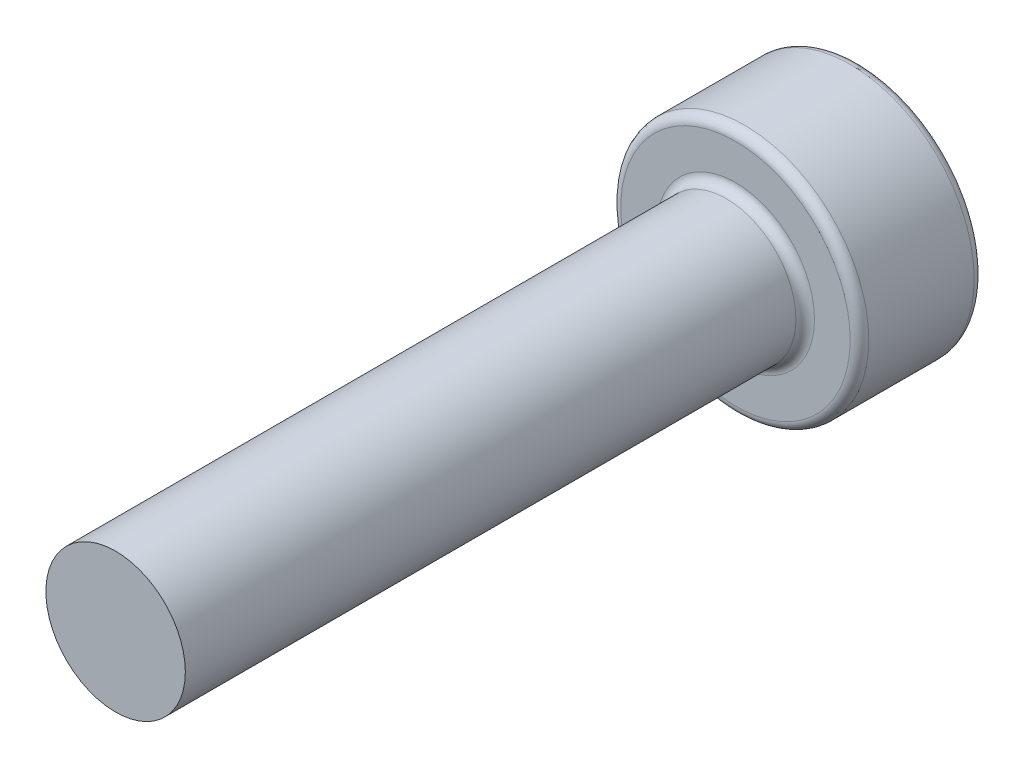
ISO-10303-21;
HEADER;
FILE_DESCRIPTION(('STEP AP214'),'2;1');
FILE_NAME('part.step','',(''),(''),'','','');
FILE_SCHEMA(('AUTOMOTIVE_DESIGN { 1 0 10303 214 1 1 1 1 }'));
ENDSEC;
DATA;
#1=APPLICATION_CONTEXT('core data for automotive mechanical design processes');
#2=APPLICATION_PROTOCOL_DEFINITION('international standard','automotive_design',2000,#1);
#3=PRODUCT_CONTEXT('',#1,'mechanical');
#4=PRODUCT('Part','Part','',(#3));
#5=PRODUCT_RELATED_PRODUCT_CATEGORY('part','',(#4));
#6=PRODUCT_DEFINITION_FORMATION('','',#4);
#7=PRODUCT_DEFINITION_CONTEXT('part definition',#1,'design');
#8=PRODUCT_DEFINITION('design','',#6,#7);
#9=PRODUCT_DEFINITION_SHAPE('','',#8);
#10=(LENGTH_UNIT() NAMED_UNIT(*) SI_UNIT(.MILLI.,.METRE.));
#11=(NAMED_UNIT(*) PLANE_ANGLE_UNIT() SI_UNIT($,.RADIAN.));
#12=(NAMED_UNIT(*) SI_UNIT($,.STERADIAN.) SOLID_ANGLE_UNIT());
#13=UNCERTAINTY_MEASURE_WITH_UNIT(LENGTH_MEASURE(1.E-05),#10,'distance_accuracy_value','');
#14=(GEOMETRIC_REPRESENTATION_CONTEXT(3) GLOBAL_UNCERTAINTY_ASSIGNED_CONTEXT((#13)) GLOBAL_UNIT_ASSIGNED_CONTEXT((#10,
#11,#12)) REPRESENTATION_CONTEXT('',''));
#15=CARTESIAN_POINT('',(0.,0.,0.));
#16=DIRECTION('',(0.,0.,1.));
#17=DIRECTION('',(1.,0.,0.));
#18=AXIS2_PLACEMENT_3D('',#15,#16,#17);
#19=CARTESIAN_POINT('',(2.25,0.,0.));
#20=DIRECTION('',(0.,0.,1.));
#21=DIRECTION('',(1.,0.,0.));
#22=AXIS2_PLACEMENT_3D('',#19,#20,#21);
#23=PLANE('',#22);
#24=CARTESIAN_POINT('',(0.,0.,0.));
#25=DIRECTION('',(0.,0.,1.));
#26=DIRECTION('',(1.,0.,0.));
#27=AXIS2_PLACEMENT_3D('',#24,#25,#26);
#28=CIRCLE('',#27,2.25);
#29=CARTESIAN_POINT('',(2.25,0.,0.));
#30=VERTEX_POINT('',#29);
#31=EDGE_CURVE('E143',#30,#30,#28,.T.);
#32=ORIENTED_EDGE('',*,*,#31,.T.);
#33=EDGE_LOOP('',(#32));
#34=FACE_BOUND('',#33,.T.);
#35=ADVANCED_FACE('F41',(#34),#23,.T.);
#36=CARTESIAN_POINT('',(0.,0.,-24.));
#37=DIRECTION('',(0.,0.,-1.));
#38=DIRECTION('',(-1.,0.,0.));
#39=AXIS2_PLACEMENT_3D('',#36,#37,#38);
#40=PLANE('',#39);
#41=CARTESIAN_POINT('',(0.,0.,-24.));
#42=DIRECTION('',(0.,0.,-1.));
#43=DIRECTION('',(-1.,0.,0.));
#44=AXIS2_PLACEMENT_3D('',#41,#42,#43);
#45=CIRCLE('',#44,3.7);
#46=CARTESIAN_POINT('',(-3.69999999999992,0.,-24.));
#47=VERTEX_POINT('',#46);
#48=EDGE_CURVE('E11',#47,#47,#45,.T.);
#49=ORIENTED_EDGE('',*,*,#48,.T.);
#50=EDGE_LOOP('',(#49));
#51=FACE_BOUND('',#50,.T.);
#52=DIRECTION('',(0.5,-0.866025403784439,0.));
#53=VECTOR('',#52,1.);
#54=CARTESIAN_POINT('',(1.44337567297415,2.5,-24.));
#55=LINE('',#54,#53);
#56=CARTESIAN_POINT('',(1.44337567297415,2.5,-24.));
#57=VERTEX_POINT('',#56);
#58=CARTESIAN_POINT('',(2.88675134594821,0.,-24.));
#59=VERTEX_POINT('',#58);
#60=EDGE_CURVE('E56',#57,#59,#55,.T.);
#61=ORIENTED_EDGE('',*,*,#60,.F.);
#62=DIRECTION('',(1.,0.,0.));
#63=VECTOR('',#62,1.);
#64=CARTESIAN_POINT('',(-1.44337567297398,2.5,-24.));
#65=LINE('',#64,#63);
#66=CARTESIAN_POINT('',(-1.44337567297398,2.5,-24.));
#67=VERTEX_POINT('',#66);
#68=EDGE_CURVE('E139',#67,#57,#65,.T.);
#69=ORIENTED_EDGE('',*,*,#68,.F.);
#70=DIRECTION('',(0.5,0.866025403784439,0.));
#71=VECTOR('',#70,1.);
#72=CARTESIAN_POINT('',(-2.88675134594804,0.,-24.));
#73=LINE('',#72,#71);
#74=CARTESIAN_POINT('',(-2.88675134594804,0.,-24.));
#75=VERTEX_POINT('',#74);
#76=EDGE_CURVE('E137',#75,#67,#73,.T.);
#77=ORIENTED_EDGE('',*,*,#76,.F.);
#78=DIRECTION('',(-0.5,0.866025403784439,0.));
#79=VECTOR('',#78,1.);
#80=CARTESIAN_POINT('',(-1.44337567297398,-2.5,-24.));
#81=LINE('',#80,#79);
#82=CARTESIAN_POINT('',(-1.44337567297398,-2.5,-24.));
#83=VERTEX_POINT('',#82);
#84=EDGE_CURVE('E104',#83,#75,#81,.T.);
#85=ORIENTED_EDGE('',*,*,#84,.F.);
#86=DIRECTION('',(-1.,0.,0.));
#87=VECTOR('',#86,1.);
#88=CARTESIAN_POINT('',(1.44337567297415,-2.5,-24.));
#89=LINE('',#88,#87);
#90=CARTESIAN_POINT('',(1.44337567297415,-2.5,-24.));
#91=VERTEX_POINT('',#90);
#92=EDGE_CURVE('E133',#91,#83,#89,.T.);
#93=ORIENTED_EDGE('',*,*,#92,.F.);
#94=DIRECTION('',(-0.5,-0.866025403784439,0.));
#95=VECTOR('',#94,1.);
#96=CARTESIAN_POINT('',(2.88675134594821,0.,-24.));
#97=LINE('',#96,#95);
#98=EDGE_CURVE('E130',#59,#91,#97,.T.);
#99=ORIENTED_EDGE('',*,*,#98,.F.);
#100=EDGE_LOOP('',(#61,#69,#77,#85,#93,#99));
#101=FACE_BOUND('',#100,.T.);
#102=ADVANCED_FACE('F186',(#51,#101),#40,.T.);
#103=CARTESIAN_POINT('',(0.,0.,0.));
#104=DIRECTION('',(0.,0.,1.));
#105=DIRECTION('',(1.,0.,0.));
#106=AXIS2_PLACEMENT_3D('',#103,#104,#105);
#107=CYLINDRICAL_SURFACE('',#106,4.);
#108=CARTESIAN_POINT('',(0.,0.,-20.3));
#109=DIRECTION('',(0.,0.,1.));
#110=DIRECTION('',(1.,0.,0.));
#111=AXIS2_PLACEMENT_3D('',#108,#109,#110);
#112=CIRCLE('',#111,4.);
#113=CARTESIAN_POINT('',(4.00000000000007,0.,-20.3));
#114=VERTEX_POINT('',#113);
#115=EDGE_CURVE('E49',#114,#114,#112,.F.);
#116=ORIENTED_EDGE('',*,*,#115,.T.);
#117=EDGE_LOOP('',(#116));
#118=FACE_BOUND('',#117,.T.);
#119=CARTESIAN_POINT('',(0.,0.,-23.7));
#120=DIRECTION('',(0.,0.,-1.));
#121=DIRECTION('',(-1.,0.,0.));
#122=AXIS2_PLACEMENT_3D('',#119,#120,#121);
#123=CIRCLE('',#122,4.);
#124=CARTESIAN_POINT('',(-3.99999999999992,0.,-23.7));
#125=VERTEX_POINT('',#124);
#126=EDGE_CURVE('E160',#125,#125,#123,.F.);
#127=ORIENTED_EDGE('',*,*,#126,.T.);
#128=EDGE_LOOP('',(#127));
#129=FACE_BOUND('',#128,.T.);
#130=ADVANCED_FACE('F165',(#118,#129),#107,.T.);
#131=CARTESIAN_POINT('',(4.00000000000007,0.,-20.));
#132=DIRECTION('',(0.,0.,1.));
#133=DIRECTION('',(1.,0.,0.));
#134=AXIS2_PLACEMENT_3D('',#131,#132,#133);
#135=PLANE('',#134);
#136=CARTESIAN_POINT('',(0.,0.,-20.));
#137=DIRECTION('',(0.,0.,1.));
#138=DIRECTION('',(1.,0.,0.));
#139=AXIS2_PLACEMENT_3D('',#136,#137,#138);
#140=CIRCLE('',#139,2.55);
#141=CARTESIAN_POINT('',(2.55000000000007,0.,-20.));
#142=VERTEX_POINT('',#141);
#143=EDGE_CURVE('E157',#142,#142,#140,.F.);
#144=ORIENTED_EDGE('',*,*,#143,.T.);
#145=EDGE_LOOP('',(#144));
#146=FACE_BOUND('',#145,.T.);
#147=CARTESIAN_POINT('',(0.,0.,-20.));
#148=DIRECTION('',(0.,0.,1.));
#149=DIRECTION('',(1.,0.,0.));
#150=AXIS2_PLACEMENT_3D('',#147,#148,#149);
#151=CIRCLE('',#150,3.7);
#152=CARTESIAN_POINT('',(3.70000000000007,0.,-20.));
#153=VERTEX_POINT('',#152);
#154=EDGE_CURVE('E154',#153,#153,#151,.T.);
#155=ORIENTED_EDGE('',*,*,#154,.T.);
#156=EDGE_LOOP('',(#155));
#157=FACE_BOUND('',#156,.T.);
#158=ADVANCED_FACE('F174',(#146,#157),#135,.T.);
#159=CARTESIAN_POINT('',(0.,0.,0.));
#160=DIRECTION('',(0.,0.,1.));
#161=DIRECTION('',(1.,0.,0.));
#162=AXIS2_PLACEMENT_3D('',#159,#160,#161);
#163=CYLINDRICAL_SURFACE('',#162,2.25);
#164=CARTESIAN_POINT('',(0.,0.,-19.7));
#165=DIRECTION('',(0.,0.,1.));
#166=DIRECTION('',(1.,0.,0.));
#167=AXIS2_PLACEMENT_3D('',#164,#165,#166);
#168=CIRCLE('',#167,2.25);
#169=CARTESIAN_POINT('',(2.25000000000007,0.,-19.7));
#170=VERTEX_POINT('',#169);
#171=EDGE_CURVE('E151',#170,#170,#168,.T.);
#172=ORIENTED_EDGE('',*,*,#171,.T.);
#173=EDGE_LOOP('',(#172));
#174=FACE_BOUND('',#173,.T.);
#175=ORIENTED_EDGE('',*,*,#31,.F.);
#176=EDGE_LOOP('',(#175));
#177=FACE_BOUND('',#176,.T.);
#178=ADVANCED_FACE('F176',(#174,#177),#163,.T.);
#179=CARTESIAN_POINT('',(1.44337567297414,2.5,-21.));
#180=DIRECTION('',(0.866025403784439,0.5,0.));
#181=DIRECTION('',(-0.5,0.866025403784439,0.));
#182=AXIS2_PLACEMENT_3D('',#179,#180,#181);
#183=PLANE('',#182);
#184=ORIENTED_EDGE('',*,*,#60,.T.);
#185=DIRECTION('',(0.,0.,-1.));
#186=VECTOR('',#185,1.);
#187=CARTESIAN_POINT('',(2.8867513459482,0.,-21.));
#188=LINE('',#187,#186);
#189=CARTESIAN_POINT('',(2.8867513459482,0.,-21.));
#190=VERTEX_POINT('',#189);
#191=EDGE_CURVE('E86',#190,#59,#188,.T.);
#192=ORIENTED_EDGE('',*,*,#191,.F.);
#193=DIRECTION('',(0.5,-0.866025403784439,0.));
#194=VECTOR('',#193,1.);
#195=CARTESIAN_POINT('',(1.44337567297414,2.5,-21.));
#196=LINE('',#195,#194);
#197=CARTESIAN_POINT('',(1.44337567297414,2.5,-21.));
#198=VERTEX_POINT('',#197);
#199=EDGE_CURVE('E141',#198,#190,#196,.T.);
#200=ORIENTED_EDGE('',*,*,#199,.F.);
#201=DIRECTION('',(0.,0.,-1.));
#202=VECTOR('',#201,1.);
#203=CARTESIAN_POINT('',(1.44337567297414,2.5,-21.));
#204=LINE('',#203,#202);
#205=EDGE_CURVE('E64',#198,#57,#204,.T.);
#206=ORIENTED_EDGE('',*,*,#205,.T.);
#207=EDGE_LOOP('',(#184,#192,#200,#206));
#208=FACE_BOUND('',#207,.T.);
#209=ADVANCED_FACE('F183',(#208),#183,.F.);
#210=CARTESIAN_POINT('',(-1.44337567297399,2.5,-21.));
#211=DIRECTION('',(0.,1.,0.));
#212=DIRECTION('',(-1.,0.,0.));
#213=AXIS2_PLACEMENT_3D('',#210,#211,#212);
#214=PLANE('',#213);
#215=ORIENTED_EDGE('',*,*,#68,.T.);
#216=ORIENTED_EDGE('',*,*,#205,.F.);
#217=DIRECTION('',(1.,0.,0.));
#218=VECTOR('',#217,1.);
#219=CARTESIAN_POINT('',(-1.44337567297399,2.5,-21.));
#220=LINE('',#219,#218);
#221=CARTESIAN_POINT('',(-1.44337567297399,2.5,-21.));
#222=VERTEX_POINT('',#221);
#223=EDGE_CURVE('E116',#222,#198,#220,.T.);
#224=ORIENTED_EDGE('',*,*,#223,.F.);
#225=DIRECTION('',(0.,0.,-1.));
#226=VECTOR('',#225,1.);
#227=CARTESIAN_POINT('',(-1.44337567297399,2.5,-21.));
#228=LINE('',#227,#226);
#229=EDGE_CURVE('E108',#222,#67,#228,.T.);
#230=ORIENTED_EDGE('',*,*,#229,.T.);
#231=EDGE_LOOP('',(#215,#216,#224,#230));
#232=FACE_BOUND('',#231,.T.);
#233=ADVANCED_FACE('F216',(#232),#214,.F.);
#234=CARTESIAN_POINT('',(-2.88675134594805,0.,-21.));
#235=DIRECTION('',(-0.866025403784439,0.5,0.));
#236=DIRECTION('',(-0.5,-0.866025403784439,0.));
#237=AXIS2_PLACEMENT_3D('',#234,#235,#236);
#238=PLANE('',#237);
#239=ORIENTED_EDGE('',*,*,#76,.T.);
#240=ORIENTED_EDGE('',*,*,#229,.F.);
#241=DIRECTION('',(0.5,0.866025403784439,0.));
#242=VECTOR('',#241,1.);
#243=CARTESIAN_POINT('',(-2.88675134594805,0.,-21.));
#244=LINE('',#243,#242);
#245=CARTESIAN_POINT('',(-2.88675134594805,0.,-21.));
#246=VERTEX_POINT('',#245);
#247=EDGE_CURVE('E112',#246,#222,#244,.T.);
#248=ORIENTED_EDGE('',*,*,#247,.F.);
#249=DIRECTION('',(0.,0.,-1.));
#250=VECTOR('',#249,1.);
#251=CARTESIAN_POINT('',(-2.88675134594805,0.,-21.));
#252=LINE('',#251,#250);
#253=EDGE_CURVE('E97',#246,#75,#252,.T.);
#254=ORIENTED_EDGE('',*,*,#253,.T.);
#255=EDGE_LOOP('',(#239,#240,#248,#254));
#256=FACE_BOUND('',#255,.T.);
#257=ADVANCED_FACE('F113',(#256),#238,.F.);
#258=CARTESIAN_POINT('',(-1.44337567297399,-2.5,-21.));
#259=DIRECTION('',(-0.866025403784439,-0.5,0.));
#260=DIRECTION('',(0.5,-0.866025403784439,0.));
#261=AXIS2_PLACEMENT_3D('',#258,#259,#260);
#262=PLANE('',#261);
#263=ORIENTED_EDGE('',*,*,#84,.T.);
#264=ORIENTED_EDGE('',*,*,#253,.F.);
#265=DIRECTION('',(-0.5,0.866025403784439,0.));
#266=VECTOR('',#265,1.);
#267=CARTESIAN_POINT('',(-1.44337567297399,-2.5,-21.));
#268=LINE('',#267,#266);
#269=CARTESIAN_POINT('',(-1.44337567297399,-2.5,-21.));
#270=VERTEX_POINT('',#269);
#271=EDGE_CURVE('E101',#270,#246,#268,.T.);
#272=ORIENTED_EDGE('',*,*,#271,.F.);
#273=DIRECTION('',(0.,0.,-1.));
#274=VECTOR('',#273,1.);
#275=CARTESIAN_POINT('',(-1.44337567297399,-2.5,-21.));
#276=LINE('',#275,#274);
#277=EDGE_CURVE('E109',#270,#83,#276,.T.);
#278=ORIENTED_EDGE('',*,*,#277,.T.);
#279=EDGE_LOOP('',(#263,#264,#272,#278));
#280=FACE_BOUND('',#279,.T.);
#281=ADVANCED_FACE('F99',(#280),#262,.F.);
#282=CARTESIAN_POINT('',(1.44337567297414,-2.5,-21.));
#283=DIRECTION('',(0.,-1.,0.));
#284=DIRECTION('',(1.,0.,0.));
#285=AXIS2_PLACEMENT_3D('',#282,#283,#284);
#286=PLANE('',#285);
#287=ORIENTED_EDGE('',*,*,#92,.T.);
#288=ORIENTED_EDGE('',*,*,#277,.F.);
#289=DIRECTION('',(-1.,0.,0.));
#290=VECTOR('',#289,1.);
#291=CARTESIAN_POINT('',(1.44337567297414,-2.5,-21.));
#292=LINE('',#291,#290);
#293=CARTESIAN_POINT('',(1.44337567297414,-2.5,-21.));
#294=VERTEX_POINT('',#293);
#295=EDGE_CURVE('E122',#294,#270,#292,.T.);
#296=ORIENTED_EDGE('',*,*,#295,.F.);
#297=DIRECTION('',(0.,0.,-1.));
#298=VECTOR('',#297,1.);
#299=CARTESIAN_POINT('',(1.44337567297414,-2.5,-21.));
#300=LINE('',#299,#298);
#301=EDGE_CURVE('E146',#294,#91,#300,.T.);
#302=ORIENTED_EDGE('',*,*,#301,.T.);
#303=EDGE_LOOP('',(#287,#288,#296,#302));
#304=FACE_BOUND('',#303,.T.);
#305=ADVANCED_FACE('F212',(#304),#286,.F.);
#306=CARTESIAN_POINT('',(2.8867513459482,0.,-21.));
#307=DIRECTION('',(0.866025403784438,-0.5,0.));
#308=DIRECTION('',(0.5,0.866025403784439,0.));
#309=AXIS2_PLACEMENT_3D('',#306,#307,#308);
#310=PLANE('',#309);
#311=ORIENTED_EDGE('',*,*,#98,.T.);
#312=ORIENTED_EDGE('',*,*,#301,.F.);
#313=DIRECTION('',(-0.5,-0.866025403784439,0.));
#314=VECTOR('',#313,1.);
#315=CARTESIAN_POINT('',(2.8867513459482,0.,-21.));
#316=LINE('',#315,#314);
#317=EDGE_CURVE('E124',#190,#294,#316,.T.);
#318=ORIENTED_EDGE('',*,*,#317,.F.);
#319=ORIENTED_EDGE('',*,*,#191,.T.);
#320=EDGE_LOOP('',(#311,#312,#318,#319));
#321=FACE_BOUND('',#320,.T.);
#322=ADVANCED_FACE('F202',(#321),#310,.F.);
#323=CARTESIAN_POINT('',(0.,0.,-21.));
#324=DIRECTION('',(0.,0.,-1.));
#325=DIRECTION('',(-1.,0.,0.));
#326=AXIS2_PLACEMENT_3D('',#323,#324,#325);
#327=PLANE('',#326);
#328=ORIENTED_EDGE('',*,*,#199,.T.);
#329=ORIENTED_EDGE('',*,*,#317,.T.);
#330=ORIENTED_EDGE('',*,*,#295,.T.);
#331=ORIENTED_EDGE('',*,*,#271,.T.);
#332=ORIENTED_EDGE('',*,*,#247,.T.);
#333=ORIENTED_EDGE('',*,*,#223,.T.);
#334=EDGE_LOOP('',(#328,#329,#330,#331,#332,#333));
#335=FACE_BOUND('',#334,.T.);
#336=ADVANCED_FACE('F119',(#335),#327,.T.);
#337=CARTESIAN_POINT('',(0.,0.,-19.7));
#338=DIRECTION('',(0.,0.,1.));
#339=DIRECTION('',(1.,0.,0.));
#340=AXIS2_PLACEMENT_3D('',#337,#338,#339);
#341=TOROIDAL_SURFACE('',#340,2.55,0.3);
#342=ORIENTED_EDGE('',*,*,#143,.F.);
#343=EDGE_LOOP('',(#342));
#344=FACE_BOUND('',#343,.T.);
#345=ORIENTED_EDGE('',*,*,#171,.F.);
#346=EDGE_LOOP('',(#345));
#347=FACE_BOUND('',#346,.T.);
#348=ADVANCED_FACE('F171',(#344,#347),#341,.F.);
#349=CARTESIAN_POINT('',(0.,0.,-20.3));
#350=DIRECTION('',(0.,0.,1.));
#351=DIRECTION('',(1.,0.,0.));
#352=AXIS2_PLACEMENT_3D('',#349,#350,#351);
#353=TOROIDAL_SURFACE('',#352,3.7,0.3);
#354=ORIENTED_EDGE('',*,*,#115,.F.);
#355=EDGE_LOOP('',(#354));
#356=FACE_BOUND('',#355,.T.);
#357=ORIENTED_EDGE('',*,*,#154,.F.);
#358=EDGE_LOOP('',(#357));
#359=FACE_BOUND('',#358,.T.);
#360=ADVANCED_FACE('F168',(#356,#359),#353,.T.);
#361=CARTESIAN_POINT('',(0.,0.,-23.7));
#362=DIRECTION('',(0.,0.,-1.));
#363=DIRECTION('',(-1.,0.,0.));
#364=AXIS2_PLACEMENT_3D('',#361,#362,#363);
#365=TOROIDAL_SURFACE('',#364,3.7,0.3);
#366=ORIENTED_EDGE('',*,*,#48,.F.);
#367=EDGE_LOOP('',(#366));
#368=FACE_BOUND('',#367,.T.);
#369=ORIENTED_EDGE('',*,*,#126,.F.);
#370=EDGE_LOOP('',(#369));
#371=FACE_BOUND('',#370,.T.);
#372=ADVANCED_FACE('F43',(#368,#371),#365,.T.);
#373=CLOSED_SHELL('',(#35,#102,#130,#158,#178,#209,#233,#257,#281,#305,#322,#336,#348,#360,#372));
#374=MANIFOLD_SOLID_BREP('B2',#373);
#375=ADVANCED_BREP_SHAPE_REPRESENTATION('',(#18,#374),#14);
#376=SHAPE_DEFINITION_REPRESENTATION(#9,#375);
ENDSEC;
END-ISO-10303-21;
